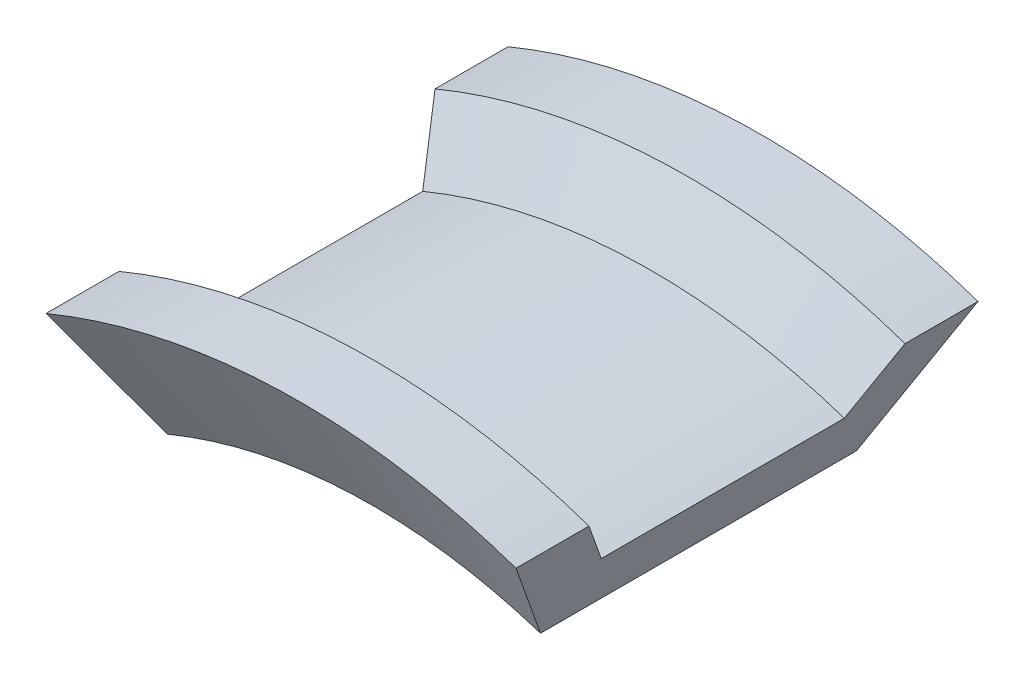
ISO-10303-21;
HEADER;
FILE_DESCRIPTION(('STEP AP214'),'2;1');
FILE_NAME('part.step','',(''),(''),'','','');
FILE_SCHEMA(('AUTOMOTIVE_DESIGN { 1 0 10303 214 1 1 1 1 }'));
ENDSEC;
DATA;
#1=APPLICATION_CONTEXT('core data for automotive mechanical design processes');
#2=APPLICATION_PROTOCOL_DEFINITION('international standard','automotive_design',2000,#1);
#3=PRODUCT_CONTEXT('',#1,'mechanical');
#4=PRODUCT('Part','Part','',(#3));
#5=PRODUCT_RELATED_PRODUCT_CATEGORY('part','',(#4));
#6=PRODUCT_DEFINITION_FORMATION('','',#4);
#7=PRODUCT_DEFINITION_CONTEXT('part definition',#1,'design');
#8=PRODUCT_DEFINITION('design','',#6,#7);
#9=PRODUCT_DEFINITION_SHAPE('','',#8);
#10=(LENGTH_UNIT() NAMED_UNIT(*) SI_UNIT(.MILLI.,.METRE.));
#11=(NAMED_UNIT(*) PLANE_ANGLE_UNIT() SI_UNIT($,.RADIAN.));
#12=(NAMED_UNIT(*) SI_UNIT($,.STERADIAN.) SOLID_ANGLE_UNIT());
#13=UNCERTAINTY_MEASURE_WITH_UNIT(LENGTH_MEASURE(1.E-05),#10,'distance_accuracy_value','');
#14=(GEOMETRIC_REPRESENTATION_CONTEXT(3) GLOBAL_UNCERTAINTY_ASSIGNED_CONTEXT((#13)) GLOBAL_UNIT_ASSIGNED_CONTEXT((#10,
#11,#12)) REPRESENTATION_CONTEXT('',''));
#15=CARTESIAN_POINT('',(0.,0.,0.));
#16=DIRECTION('',(0.,0.,1.));
#17=DIRECTION('',(1.,0.,0.));
#18=AXIS2_PLACEMENT_3D('',#15,#16,#17);
#19=CARTESIAN_POINT('',(-3.2,-27.,0.));
#20=DIRECTION('',(1.,0.,0.));
#21=DIRECTION('',(0.,0.,-1.));
#22=AXIS2_PLACEMENT_3D('',#19,#20,#21);
#23=PLANE('',#22);
#24=CARTESIAN_POINT('',(-3.2,-27.,0.));
#25=DIRECTION('',(1.,0.,0.));
#26=DIRECTION('',(0.,0.,-1.));
#27=AXIS2_PLACEMENT_3D('',#24,#25,#26);
#28=CIRCLE('',#27,6.5);
#29=CARTESIAN_POINT('',(-3.2,-28.6823237931664,6.27851787087894));
#30=VERTEX_POINT('',#29);
#31=CARTESIAN_POINT('',(-3.2,-28.6823237931664,-6.27851787087894));
#32=VERTEX_POINT('',#31);
#33=EDGE_CURVE('E104',#30,#32,#28,.T.);
#34=ORIENTED_EDGE('',*,*,#33,.T.);
#35=DIRECTION('',(0.,0.965925826289068,-0.258819045102521));
#36=VECTOR('',#35,1.);
#37=CARTESIAN_POINT('',(-3.2,-28.6823237931664,-6.27851787087894));
#38=LINE('',#37,#36);
#39=CARTESIAN_POINT('',(-3.2,-16.3880902633976,-9.57274781674013));
#40=VERTEX_POINT('',#39);
#41=EDGE_CURVE('E99',#32,#40,#38,.T.);
#42=ORIENTED_EDGE('',*,*,#41,.T.);
#43=DIRECTION('',(0.,0.,1.));
#44=VECTOR('',#43,1.);
#45=CARTESIAN_POINT('',(-3.2,-16.3880902633976,-9.57274781674013));
#46=LINE('',#45,#44);
#47=CARTESIAN_POINT('',(-3.2,-16.3880902633976,9.57274781674012));
#48=VERTEX_POINT('',#47);
#49=EDGE_CURVE('E102',#40,#48,#46,.T.);
#50=ORIENTED_EDGE('',*,*,#49,.T.);
#51=DIRECTION('',(0.,-0.965925826289068,-0.258819045102522));
#52=VECTOR('',#51,1.);
#53=CARTESIAN_POINT('',(-3.2,-28.6823237931664,6.27851787087894));
#54=LINE('',#53,#52);
#55=EDGE_CURVE('E69',#48,#30,#54,.T.);
#56=ORIENTED_EDGE('',*,*,#55,.T.);
#57=EDGE_LOOP('',(#34,#42,#50,#56));
#58=FACE_BOUND('',#57,.T.);
#59=CARTESIAN_POINT('',(-3.2,-27.,0.));
#60=DIRECTION('',(1.,0.,0.));
#61=DIRECTION('',(0.,0.,-1.));
#62=AXIS2_PLACEMENT_3D('',#59,#60,#61);
#63=CIRCLE('',#62,3.00000000000001);
#64=CARTESIAN_POINT('',(-3.2,-27.,-3.00000000000001));
#65=VERTEX_POINT('',#64);
#66=EDGE_CURVE('E119',#65,#65,#63,.T.);
#67=ORIENTED_EDGE('',*,*,#66,.F.);
#68=EDGE_LOOP('',(#67));
#69=FACE_BOUND('',#68,.T.);
#70=ADVANCED_FACE('F52',(#58,#69),#23,.T.);
#71=CARTESIAN_POINT('',(-6.4,-27.,0.));
#72=DIRECTION('',(1.,0.,0.));
#73=DIRECTION('',(0.,0.,-1.));
#74=AXIS2_PLACEMENT_3D('',#71,#72,#73);
#75=PLANE('',#74);
#76=CARTESIAN_POINT('',(-6.4,-27.,0.));
#77=DIRECTION('',(1.,0.,0.));
#78=DIRECTION('',(0.,0.,-1.));
#79=AXIS2_PLACEMENT_3D('',#76,#77,#78);
#80=CIRCLE('',#79,6.5);
#81=CARTESIAN_POINT('',(-6.4,-28.6823237931664,6.27851787087894));
#82=VERTEX_POINT('',#81);
#83=CARTESIAN_POINT('',(-6.4,-28.6823237931664,-6.27851787087894));
#84=VERTEX_POINT('',#83);
#85=EDGE_CURVE('E116',#82,#84,#80,.T.);
#86=ORIENTED_EDGE('',*,*,#85,.F.);
#87=DIRECTION('',(0.,-0.965925826289068,-0.258819045102522));
#88=VECTOR('',#87,1.);
#89=CARTESIAN_POINT('',(-6.4,-28.6823237931664,6.27851787087894));
#90=LINE('',#89,#88);
#91=CARTESIAN_POINT('',(-6.4,-16.3880902633976,9.57274781674012));
#92=VERTEX_POINT('',#91);
#93=EDGE_CURVE('E92',#92,#82,#90,.T.);
#94=ORIENTED_EDGE('',*,*,#93,.F.);
#95=DIRECTION('',(0.,0.,1.));
#96=VECTOR('',#95,1.);
#97=CARTESIAN_POINT('',(-6.4,-16.3880902633976,-9.57274781674013));
#98=LINE('',#97,#96);
#99=CARTESIAN_POINT('',(-6.4,-16.3880902633976,-9.57274781674013));
#100=VERTEX_POINT('',#99);
#101=EDGE_CURVE('E86',#100,#92,#98,.T.);
#102=ORIENTED_EDGE('',*,*,#101,.F.);
#103=DIRECTION('',(0.,0.965925826289068,-0.258819045102521));
#104=VECTOR('',#103,1.);
#105=CARTESIAN_POINT('',(-6.4,-28.6823237931664,-6.27851787087894));
#106=LINE('',#105,#104);
#107=EDGE_CURVE('E108',#84,#100,#106,.T.);
#108=ORIENTED_EDGE('',*,*,#107,.F.);
#109=EDGE_LOOP('',(#86,#94,#102,#108));
#110=FACE_BOUND('',#109,.T.);
#111=CARTESIAN_POINT('',(-6.4,-27.,0.));
#112=DIRECTION('',(1.,0.,0.));
#113=DIRECTION('',(0.,0.,-1.));
#114=AXIS2_PLACEMENT_3D('',#111,#112,#113);
#115=CIRCLE('',#114,3.00000000000001);
#116=CARTESIAN_POINT('',(-6.4,-27.,-3.00000000000001));
#117=VERTEX_POINT('',#116);
#118=EDGE_CURVE('E131',#117,#117,#115,.T.);
#119=ORIENTED_EDGE('',*,*,#118,.T.);
#120=EDGE_LOOP('',(#119));
#121=FACE_BOUND('',#120,.T.);
#122=ADVANCED_FACE('F127',(#110,#121),#75,.F.);
#123=CARTESIAN_POINT('',(-3.2,-27.,0.));
#124=DIRECTION('',(-1.,0.,0.));
#125=DIRECTION('',(0.,0.,1.));
#126=AXIS2_PLACEMENT_3D('',#123,#124,#125);
#127=CYLINDRICAL_SURFACE('',#126,6.5);
#128=ORIENTED_EDGE('',*,*,#85,.T.);
#129=DIRECTION('',(-1.,0.,0.));
#130=VECTOR('',#129,1.);
#131=CARTESIAN_POINT('',(-3.2,-28.6823237931664,-6.27851787087894));
#132=LINE('',#131,#130);
#133=EDGE_CURVE('E12',#32,#84,#132,.T.);
#134=ORIENTED_EDGE('',*,*,#133,.F.);
#135=ORIENTED_EDGE('',*,*,#33,.F.);
#136=DIRECTION('',(-1.,0.,0.));
#137=VECTOR('',#136,1.);
#138=CARTESIAN_POINT('',(-3.2,-28.6823237931664,6.27851787087894));
#139=LINE('',#138,#137);
#140=EDGE_CURVE('E112',#30,#82,#139,.T.);
#141=ORIENTED_EDGE('',*,*,#140,.T.);
#142=EDGE_LOOP('',(#128,#134,#135,#141));
#143=FACE_BOUND('',#142,.T.);
#144=ADVANCED_FACE('F54',(#143),#127,.T.);
#145=CARTESIAN_POINT('',(-3.2,-28.6823237931664,-6.27851787087894));
#146=DIRECTION('',(0.,0.258819045102521,0.965925826289068));
#147=DIRECTION('',(0.,-0.965925826289068,0.258819045102521));
#148=AXIS2_PLACEMENT_3D('',#145,#146,#147);
#149=PLANE('',#148);
#150=ORIENTED_EDGE('',*,*,#107,.T.);
#151=DIRECTION('',(-1.,0.,0.));
#152=VECTOR('',#151,1.);
#153=CARTESIAN_POINT('',(-3.2,-16.3880902633976,-9.57274781674013));
#154=LINE('',#153,#152);
#155=EDGE_CURVE('E61',#40,#100,#154,.T.);
#156=ORIENTED_EDGE('',*,*,#155,.F.);
#157=ORIENTED_EDGE('',*,*,#41,.F.);
#158=ORIENTED_EDGE('',*,*,#133,.T.);
#159=EDGE_LOOP('',(#150,#156,#157,#158));
#160=FACE_BOUND('',#159,.T.);
#161=ADVANCED_FACE('F107',(#160),#149,.F.);
#162=CARTESIAN_POINT('',(-3.2,-16.3880902633976,-9.57274781674013));
#163=DIRECTION('',(0.,-1.,0.));
#164=DIRECTION('',(0.,0.,-1.));
#165=AXIS2_PLACEMENT_3D('',#162,#163,#164);
#166=PLANE('',#165);
#167=ORIENTED_EDGE('',*,*,#101,.T.);
#168=DIRECTION('',(-1.,0.,0.));
#169=VECTOR('',#168,1.);
#170=CARTESIAN_POINT('',(-3.2,-16.3880902633976,9.57274781674012));
#171=LINE('',#170,#169);
#172=EDGE_CURVE('E109',#48,#92,#171,.T.);
#173=ORIENTED_EDGE('',*,*,#172,.F.);
#174=ORIENTED_EDGE('',*,*,#49,.F.);
#175=ORIENTED_EDGE('',*,*,#155,.T.);
#176=EDGE_LOOP('',(#167,#173,#174,#175));
#177=FACE_BOUND('',#176,.T.);
#178=ADVANCED_FACE('F110',(#177),#166,.F.);
#179=CARTESIAN_POINT('',(-3.2,-28.6823237931664,6.27851787087894));
#180=DIRECTION('',(0.,0.258819045102522,-0.965925826289068));
#181=DIRECTION('',(0.,0.965925826289068,0.258819045102522));
#182=AXIS2_PLACEMENT_3D('',#179,#180,#181);
#183=PLANE('',#182);
#184=ORIENTED_EDGE('',*,*,#93,.T.);
#185=ORIENTED_EDGE('',*,*,#140,.F.);
#186=ORIENTED_EDGE('',*,*,#55,.F.);
#187=ORIENTED_EDGE('',*,*,#172,.T.);
#188=EDGE_LOOP('',(#184,#185,#186,#187));
#189=FACE_BOUND('',#188,.T.);
#190=ADVANCED_FACE('F124',(#189),#183,.F.);
#191=CARTESIAN_POINT('',(-3.2,-27.,0.));
#192=DIRECTION('',(-1.,0.,0.));
#193=DIRECTION('',(0.,0.,1.));
#194=AXIS2_PLACEMENT_3D('',#191,#192,#193);
#195=CYLINDRICAL_SURFACE('',#194,3.00000000000001);
#196=ORIENTED_EDGE('',*,*,#66,.T.);
#197=EDGE_LOOP('',(#196));
#198=FACE_BOUND('',#197,.T.);
#199=ORIENTED_EDGE('',*,*,#118,.F.);
#200=EDGE_LOOP('',(#199));
#201=FACE_BOUND('',#200,.T.);
#202=ADVANCED_FACE('F137',(#198,#201),#195,.F.);
#203=CLOSED_SHELL('',(#70,#122,#144,#161,#178,#190,#202));
#204=MANIFOLD_SOLID_BREP('B2',#203);
#205=CARTESIAN_POINT('',(9.6,-27.,0.));
#206=DIRECTION('',(-1.,0.,0.));
#207=DIRECTION('',(0.,0.,1.));
#208=AXIS2_PLACEMENT_3D('',#205,#206,#207);
#209=CYLINDRICAL_SURFACE('',#208,3.00000000000001);
#210=CARTESIAN_POINT('',(6.4,-27.,0.));
#211=DIRECTION('',(1.,0.,0.));
#212=DIRECTION('',(0.,0.,-1.));
#213=AXIS2_PLACEMENT_3D('',#210,#211,#212);
#214=CIRCLE('',#213,3.00000000000001);
#215=CARTESIAN_POINT('',(6.4,-27.,-3.00000000000001));
#216=VERTEX_POINT('',#215);
#217=EDGE_CURVE('E262',#216,#216,#214,.T.);
#218=ORIENTED_EDGE('',*,*,#217,.F.);
#219=EDGE_LOOP('',(#218));
#220=FACE_BOUND('',#219,.T.);
#221=CARTESIAN_POINT('',(7.85,-27.,0.));
#222=DIRECTION('',(1.,0.,0.));
#223=DIRECTION('',(0.,0.,-1.));
#224=AXIS2_PLACEMENT_3D('',#221,#222,#223);
#225=CIRCLE('',#224,3.00000000000001);
#226=CARTESIAN_POINT('',(7.85,-27.,-3.00000000000001));
#227=VERTEX_POINT('',#226);
#228=EDGE_CURVE('E197',#227,#227,#225,.T.);
#229=ORIENTED_EDGE('',*,*,#228,.T.);
#230=EDGE_LOOP('',(#229));
#231=FACE_BOUND('',#230,.T.);
#232=ADVANCED_FACE('F193',(#220,#231),#209,.F.);
#233=CARTESIAN_POINT('',(9.6,-27.,0.));
#234=DIRECTION('',(1.,0.,0.));
#235=DIRECTION('',(0.,0.,-1.));
#236=AXIS2_PLACEMENT_3D('',#233,#234,#235);
#237=PLANE('',#236);
#238=CARTESIAN_POINT('',(9.6,-27.,0.));
#239=DIRECTION('',(1.,0.,0.));
#240=DIRECTION('',(0.,0.,-1.));
#241=AXIS2_PLACEMENT_3D('',#238,#239,#240);
#242=CIRCLE('',#241,5.25);
#243=CARTESIAN_POINT('',(9.6,-27.,-5.25000000000001));
#244=VERTEX_POINT('',#243);
#245=EDGE_CURVE('E276',#244,#244,#242,.T.);
#246=ORIENTED_EDGE('',*,*,#245,.F.);
#247=EDGE_LOOP('',(#246));
#248=FACE_BOUND('',#247,.T.);
#249=CARTESIAN_POINT('',(9.6,-27.,0.));
#250=DIRECTION('',(1.,0.,0.));
#251=DIRECTION('',(0.,0.,-1.));
#252=AXIS2_PLACEMENT_3D('',#249,#250,#251);
#253=CIRCLE('',#252,6.5);
#254=CARTESIAN_POINT('',(9.6,-28.6823237931664,6.27851787087894));
#255=VERTEX_POINT('',#254);
#256=CARTESIAN_POINT('',(9.6,-28.6823237931664,-6.27851787087894));
#257=VERTEX_POINT('',#256);
#258=EDGE_CURVE('E246',#255,#257,#253,.T.);
#259=ORIENTED_EDGE('',*,*,#258,.T.);
#260=DIRECTION('',(0.,0.965925826289068,-0.258819045102521));
#261=VECTOR('',#260,1.);
#262=CARTESIAN_POINT('',(9.6,-28.6823237931664,-6.27851787087894));
#263=LINE('',#262,#261);
#264=CARTESIAN_POINT('',(9.6,-16.3880902633976,-9.57274781674013));
#265=VERTEX_POINT('',#264);
#266=EDGE_CURVE('E241',#257,#265,#263,.T.);
#267=ORIENTED_EDGE('',*,*,#266,.T.);
#268=DIRECTION('',(0.,0.,1.));
#269=VECTOR('',#268,1.);
#270=CARTESIAN_POINT('',(9.6,-16.3880902633976,-9.57274781674013));
#271=LINE('',#270,#269);
#272=CARTESIAN_POINT('',(9.6,-16.3880902633976,9.57274781674012));
#273=VERTEX_POINT('',#272);
#274=EDGE_CURVE('E244',#265,#273,#271,.T.);
#275=ORIENTED_EDGE('',*,*,#274,.T.);
#276=DIRECTION('',(0.,-0.965925826289068,-0.258819045102522));
#277=VECTOR('',#276,1.);
#278=CARTESIAN_POINT('',(9.6,-28.6823237931664,6.27851787087894));
#279=LINE('',#278,#277);
#280=EDGE_CURVE('E211',#273,#255,#279,.T.);
#281=ORIENTED_EDGE('',*,*,#280,.T.);
#282=EDGE_LOOP('',(#259,#267,#275,#281));
#283=FACE_BOUND('',#282,.T.);
#284=ADVANCED_FACE('F242',(#248,#283),#237,.T.);
#285=CARTESIAN_POINT('',(6.4,-27.,0.));
#286=DIRECTION('',(1.,0.,0.));
#287=DIRECTION('',(0.,0.,-1.));
#288=AXIS2_PLACEMENT_3D('',#285,#286,#287);
#289=PLANE('',#288);
#290=CARTESIAN_POINT('',(6.4,-27.,0.));
#291=DIRECTION('',(1.,0.,0.));
#292=DIRECTION('',(0.,0.,-1.));
#293=AXIS2_PLACEMENT_3D('',#290,#291,#292);
#294=CIRCLE('',#293,6.5);
#295=CARTESIAN_POINT('',(6.4,-28.6823237931664,6.27851787087894));
#296=VERTEX_POINT('',#295);
#297=CARTESIAN_POINT('',(6.4,-28.6823237931664,-6.27851787087894));
#298=VERTEX_POINT('',#297);
#299=EDGE_CURVE('E259',#296,#298,#294,.T.);
#300=ORIENTED_EDGE('',*,*,#299,.F.);
#301=DIRECTION('',(0.,-0.965925826289068,-0.258819045102522));
#302=VECTOR('',#301,1.);
#303=CARTESIAN_POINT('',(6.4,-28.6823237931664,6.27851787087894));
#304=LINE('',#303,#302);
#305=CARTESIAN_POINT('',(6.4,-16.3880902633976,9.57274781674012));
#306=VERTEX_POINT('',#305);
#307=EDGE_CURVE('E234',#306,#296,#304,.T.);
#308=ORIENTED_EDGE('',*,*,#307,.F.);
#309=DIRECTION('',(0.,0.,1.));
#310=VECTOR('',#309,1.);
#311=CARTESIAN_POINT('',(6.4,-16.3880902633976,-9.57274781674013));
#312=LINE('',#311,#310);
#313=CARTESIAN_POINT('',(6.4,-16.3880902633976,-9.57274781674013));
#314=VERTEX_POINT('',#313);
#315=EDGE_CURVE('E228',#314,#306,#312,.T.);
#316=ORIENTED_EDGE('',*,*,#315,.F.);
#317=DIRECTION('',(0.,0.965925826289068,-0.258819045102521));
#318=VECTOR('',#317,1.);
#319=CARTESIAN_POINT('',(6.4,-28.6823237931664,-6.27851787087894));
#320=LINE('',#319,#318);
#321=EDGE_CURVE('E250',#298,#314,#320,.T.);
#322=ORIENTED_EDGE('',*,*,#321,.F.);
#323=EDGE_LOOP('',(#300,#308,#316,#322));
#324=FACE_BOUND('',#323,.T.);
#325=ORIENTED_EDGE('',*,*,#217,.T.);
#326=EDGE_LOOP('',(#325));
#327=FACE_BOUND('',#326,.T.);
#328=ADVANCED_FACE('F270',(#324,#327),#289,.F.);
#329=CARTESIAN_POINT('',(9.6,-27.,0.));
#330=DIRECTION('',(-1.,0.,0.));
#331=DIRECTION('',(0.,0.,1.));
#332=AXIS2_PLACEMENT_3D('',#329,#330,#331);
#333=CYLINDRICAL_SURFACE('',#332,6.5);
#334=ORIENTED_EDGE('',*,*,#299,.T.);
#335=DIRECTION('',(-1.,0.,0.));
#336=VECTOR('',#335,1.);
#337=CARTESIAN_POINT('',(9.6,-28.6823237931664,-6.27851787087894));
#338=LINE('',#337,#336);
#339=EDGE_CURVE('E50',#257,#298,#338,.T.);
#340=ORIENTED_EDGE('',*,*,#339,.F.);
#341=ORIENTED_EDGE('',*,*,#258,.F.);
#342=DIRECTION('',(-1.,0.,0.));
#343=VECTOR('',#342,1.);
#344=CARTESIAN_POINT('',(9.6,-28.6823237931664,6.27851787087894));
#345=LINE('',#344,#343);
#346=EDGE_CURVE('E255',#255,#296,#345,.T.);
#347=ORIENTED_EDGE('',*,*,#346,.T.);
#348=EDGE_LOOP('',(#334,#340,#341,#347));
#349=FACE_BOUND('',#348,.T.);
#350=ADVANCED_FACE('F195',(#349),#333,.T.);
#351=CARTESIAN_POINT('',(9.6,-28.6823237931664,-6.27851787087894));
#352=DIRECTION('',(0.,0.258819045102521,0.965925826289068));
#353=DIRECTION('',(0.,-0.965925826289068,0.258819045102521));
#354=AXIS2_PLACEMENT_3D('',#351,#352,#353);
#355=PLANE('',#354);
#356=ORIENTED_EDGE('',*,*,#321,.T.);
#357=DIRECTION('',(-1.,0.,0.));
#358=VECTOR('',#357,1.);
#359=CARTESIAN_POINT('',(9.6,-16.3880902633976,-9.57274781674013));
#360=LINE('',#359,#358);
#361=EDGE_CURVE('E203',#265,#314,#360,.T.);
#362=ORIENTED_EDGE('',*,*,#361,.F.);
#363=ORIENTED_EDGE('',*,*,#266,.F.);
#364=ORIENTED_EDGE('',*,*,#339,.T.);
#365=EDGE_LOOP('',(#356,#362,#363,#364));
#366=FACE_BOUND('',#365,.T.);
#367=ADVANCED_FACE('F249',(#366),#355,.F.);
#368=CARTESIAN_POINT('',(9.6,-16.3880902633976,-9.57274781674013));
#369=DIRECTION('',(0.,-1.,0.));
#370=DIRECTION('',(0.,0.,-1.));
#371=AXIS2_PLACEMENT_3D('',#368,#369,#370);
#372=PLANE('',#371);
#373=ORIENTED_EDGE('',*,*,#315,.T.);
#374=DIRECTION('',(-1.,0.,0.));
#375=VECTOR('',#374,1.);
#376=CARTESIAN_POINT('',(9.6,-16.3880902633976,9.57274781674012));
#377=LINE('',#376,#375);
#378=EDGE_CURVE('E251',#273,#306,#377,.T.);
#379=ORIENTED_EDGE('',*,*,#378,.F.);
#380=ORIENTED_EDGE('',*,*,#274,.F.);
#381=ORIENTED_EDGE('',*,*,#361,.T.);
#382=EDGE_LOOP('',(#373,#379,#380,#381));
#383=FACE_BOUND('',#382,.T.);
#384=ADVANCED_FACE('F253',(#383),#372,.F.);
#385=CARTESIAN_POINT('',(9.6,-28.6823237931664,6.27851787087894));
#386=DIRECTION('',(0.,0.258819045102522,-0.965925826289068));
#387=DIRECTION('',(0.,0.965925826289068,0.258819045102522));
#388=AXIS2_PLACEMENT_3D('',#385,#386,#387);
#389=PLANE('',#388);
#390=ORIENTED_EDGE('',*,*,#307,.T.);
#391=ORIENTED_EDGE('',*,*,#346,.F.);
#392=ORIENTED_EDGE('',*,*,#280,.F.);
#393=ORIENTED_EDGE('',*,*,#378,.T.);
#394=EDGE_LOOP('',(#390,#391,#392,#393));
#395=FACE_BOUND('',#394,.T.);
#396=ADVANCED_FACE('F267',(#395),#389,.F.);
#397=CARTESIAN_POINT('',(7.85,-27.,0.));
#398=DIRECTION('',(1.,0.,0.));
#399=DIRECTION('',(0.,0.,-1.));
#400=AXIS2_PLACEMENT_3D('',#397,#398,#399);
#401=CYLINDRICAL_SURFACE('',#400,5.25);
#402=CARTESIAN_POINT('',(7.85,-27.,0.));
#403=DIRECTION('',(1.,0.,0.));
#404=DIRECTION('',(0.,0.,-1.));
#405=AXIS2_PLACEMENT_3D('',#402,#403,#404);
#406=CIRCLE('',#405,5.25);
#407=CARTESIAN_POINT('',(7.85,-27.,-5.25000000000001));
#408=VERTEX_POINT('',#407);
#409=EDGE_CURVE('E279',#408,#408,#406,.T.);
#410=ORIENTED_EDGE('',*,*,#409,.F.);
#411=EDGE_LOOP('',(#410));
#412=FACE_BOUND('',#411,.T.);
#413=ORIENTED_EDGE('',*,*,#245,.T.);
#414=EDGE_LOOP('',(#413));
#415=FACE_BOUND('',#414,.T.);
#416=ADVANCED_FACE('F289',(#412,#415),#401,.F.);
#417=CARTESIAN_POINT('',(7.85,-27.,0.));
#418=DIRECTION('',(1.,0.,0.));
#419=DIRECTION('',(0.,0.,-1.));
#420=AXIS2_PLACEMENT_3D('',#417,#418,#419);
#421=PLANE('',#420);
#422=ORIENTED_EDGE('',*,*,#228,.F.);
#423=EDGE_LOOP('',(#422));
#424=FACE_BOUND('',#423,.T.);
#425=ORIENTED_EDGE('',*,*,#409,.T.);
#426=EDGE_LOOP('',(#425));
#427=FACE_BOUND('',#426,.T.);
#428=ADVANCED_FACE('F287',(#424,#427),#421,.T.);
#429=CLOSED_SHELL('',(#232,#284,#328,#350,#367,#384,#396,#416,#428));
#430=MANIFOLD_SOLID_BREP('B6',#429);
#431=CARTESIAN_POINT('',(3.2,-27.,0.));
#432=DIRECTION('',(1.,0.,0.));
#433=DIRECTION('',(0.,0.,-1.));
#434=AXIS2_PLACEMENT_3D('',#431,#432,#433);
#435=PLANE('',#434);
#436=CARTESIAN_POINT('',(3.2,-27.,0.));
#437=DIRECTION('',(1.,0.,0.));
#438=DIRECTION('',(0.,0.,-1.));
#439=AXIS2_PLACEMENT_3D('',#436,#437,#438);
#440=CIRCLE('',#439,6.5);
#441=CARTESIAN_POINT('',(3.2,-28.6823237931664,6.27851787087894));
#442=VERTEX_POINT('',#441);
#443=CARTESIAN_POINT('',(3.2,-28.6823237931664,-6.27851787087894));
#444=VERTEX_POINT('',#443);
#445=EDGE_CURVE('E411',#442,#444,#440,.T.);
#446=ORIENTED_EDGE('',*,*,#445,.T.);
#447=DIRECTION('',(0.,0.965925826289068,-0.258819045102521));
#448=VECTOR('',#447,1.);
#449=CARTESIAN_POINT('',(3.2,-28.6823237931664,-6.27851787087894));
#450=LINE('',#449,#448);
#451=CARTESIAN_POINT('',(3.2,-16.3880902633976,-9.57274781674013));
#452=VERTEX_POINT('',#451);
#453=EDGE_CURVE('E406',#444,#452,#450,.T.);
#454=ORIENTED_EDGE('',*,*,#453,.T.);
#455=DIRECTION('',(0.,0.,1.));
#456=VECTOR('',#455,1.);
#457=CARTESIAN_POINT('',(3.2,-16.3880902633976,-9.57274781674013));
#458=LINE('',#457,#456);
#459=CARTESIAN_POINT('',(3.2,-16.3880902633976,9.57274781674012));
#460=VERTEX_POINT('',#459);
#461=EDGE_CURVE('E409',#452,#460,#458,.T.);
#462=ORIENTED_EDGE('',*,*,#461,.T.);
#463=DIRECTION('',(0.,-0.965925826289068,-0.258819045102522));
#464=VECTOR('',#463,1.);
#465=CARTESIAN_POINT('',(3.2,-28.6823237931664,6.27851787087894));
#466=LINE('',#465,#464);
#467=EDGE_CURVE('E376',#460,#442,#466,.T.);
#468=ORIENTED_EDGE('',*,*,#467,.T.);
#469=EDGE_LOOP('',(#446,#454,#462,#468));
#470=FACE_BOUND('',#469,.T.);
#471=CARTESIAN_POINT('',(3.2,-27.,0.));
#472=DIRECTION('',(1.,0.,0.));
#473=DIRECTION('',(0.,0.,-1.));
#474=AXIS2_PLACEMENT_3D('',#471,#472,#473);
#475=CIRCLE('',#474,3.00000000000001);
#476=CARTESIAN_POINT('',(3.2,-27.,-3.00000000000001));
#477=VERTEX_POINT('',#476);
#478=EDGE_CURVE('E426',#477,#477,#475,.T.);
#479=ORIENTED_EDGE('',*,*,#478,.F.);
#480=EDGE_LOOP('',(#479));
#481=FACE_BOUND('',#480,.T.);
#482=ADVANCED_FACE('F359',(#470,#481),#435,.T.);
#483=CARTESIAN_POINT('',(0.,-27.,0.));
#484=DIRECTION('',(1.,0.,0.));
#485=DIRECTION('',(0.,0.,-1.));
#486=AXIS2_PLACEMENT_3D('',#483,#484,#485);
#487=PLANE('',#486);
#488=CARTESIAN_POINT('',(0.,-27.,0.));
#489=DIRECTION('',(1.,0.,0.));
#490=DIRECTION('',(0.,0.,-1.));
#491=AXIS2_PLACEMENT_3D('',#488,#489,#490);
#492=CIRCLE('',#491,6.5);
#493=CARTESIAN_POINT('',(0.,-28.6823237931664,6.27851787087894));
#494=VERTEX_POINT('',#493);
#495=CARTESIAN_POINT('',(0.,-28.6823237931664,-6.27851787087894));
#496=VERTEX_POINT('',#495);
#497=EDGE_CURVE('E423',#494,#496,#492,.T.);
#498=ORIENTED_EDGE('',*,*,#497,.F.);
#499=DIRECTION('',(0.,-0.965925826289068,-0.258819045102522));
#500=VECTOR('',#499,1.);
#501=CARTESIAN_POINT('',(0.,-28.6823237931664,6.27851787087894));
#502=LINE('',#501,#500);
#503=CARTESIAN_POINT('',(0.,-16.3880902633976,9.57274781674012));
#504=VERTEX_POINT('',#503);
#505=EDGE_CURVE('E399',#504,#494,#502,.T.);
#506=ORIENTED_EDGE('',*,*,#505,.F.);
#507=DIRECTION('',(0.,0.,1.));
#508=VECTOR('',#507,1.);
#509=CARTESIAN_POINT('',(0.,-16.3880902633976,-9.57274781674013));
#510=LINE('',#509,#508);
#511=CARTESIAN_POINT('',(0.,-16.3880902633976,-9.57274781674013));
#512=VERTEX_POINT('',#511);
#513=EDGE_CURVE('E393',#512,#504,#510,.T.);
#514=ORIENTED_EDGE('',*,*,#513,.F.);
#515=DIRECTION('',(0.,0.965925826289068,-0.258819045102521));
#516=VECTOR('',#515,1.);
#517=CARTESIAN_POINT('',(0.,-28.6823237931664,-6.27851787087894));
#518=LINE('',#517,#516);
#519=EDGE_CURVE('E415',#496,#512,#518,.T.);
#520=ORIENTED_EDGE('',*,*,#519,.F.);
#521=EDGE_LOOP('',(#498,#506,#514,#520));
#522=FACE_BOUND('',#521,.T.);
#523=CARTESIAN_POINT('',(0.,-27.,0.));
#524=DIRECTION('',(1.,0.,0.));
#525=DIRECTION('',(0.,0.,-1.));
#526=AXIS2_PLACEMENT_3D('',#523,#524,#525);
#527=CIRCLE('',#526,3.00000000000001);
#528=CARTESIAN_POINT('',(0.,-27.,-3.00000000000001));
#529=VERTEX_POINT('',#528);
#530=EDGE_CURVE('E438',#529,#529,#527,.T.);
#531=ORIENTED_EDGE('',*,*,#530,.T.);
#532=EDGE_LOOP('',(#531));
#533=FACE_BOUND('',#532,.T.);
#534=ADVANCED_FACE('F434',(#522,#533),#487,.F.);
#535=CARTESIAN_POINT('',(3.2,-27.,0.));
#536=DIRECTION('',(-1.,0.,0.));
#537=DIRECTION('',(0.,0.,1.));
#538=AXIS2_PLACEMENT_3D('',#535,#536,#537);
#539=CYLINDRICAL_SURFACE('',#538,6.5);
#540=ORIENTED_EDGE('',*,*,#497,.T.);
#541=DIRECTION('',(-1.,0.,0.));
#542=VECTOR('',#541,1.);
#543=CARTESIAN_POINT('',(3.2,-28.6823237931664,-6.27851787087894));
#544=LINE('',#543,#542);
#545=EDGE_CURVE('E191',#444,#496,#544,.T.);
#546=ORIENTED_EDGE('',*,*,#545,.F.);
#547=ORIENTED_EDGE('',*,*,#445,.F.);
#548=DIRECTION('',(-1.,0.,0.));
#549=VECTOR('',#548,1.);
#550=CARTESIAN_POINT('',(3.2,-28.6823237931664,6.27851787087894));
#551=LINE('',#550,#549);
#552=EDGE_CURVE('E419',#442,#494,#551,.T.);
#553=ORIENTED_EDGE('',*,*,#552,.T.);
#554=EDGE_LOOP('',(#540,#546,#547,#553));
#555=FACE_BOUND('',#554,.T.);
#556=ADVANCED_FACE('F361',(#555),#539,.T.);
#557=CARTESIAN_POINT('',(3.2,-28.6823237931664,-6.27851787087894));
#558=DIRECTION('',(0.,0.258819045102521,0.965925826289068));
#559=DIRECTION('',(0.,-0.965925826289068,0.258819045102521));
#560=AXIS2_PLACEMENT_3D('',#557,#558,#559);
#561=PLANE('',#560);
#562=ORIENTED_EDGE('',*,*,#519,.T.);
#563=DIRECTION('',(-1.,0.,0.));
#564=VECTOR('',#563,1.);
#565=CARTESIAN_POINT('',(3.2,-16.3880902633976,-9.57274781674013));
#566=LINE('',#565,#564);
#567=EDGE_CURVE('E368',#452,#512,#566,.T.);
#568=ORIENTED_EDGE('',*,*,#567,.F.);
#569=ORIENTED_EDGE('',*,*,#453,.F.);
#570=ORIENTED_EDGE('',*,*,#545,.T.);
#571=EDGE_LOOP('',(#562,#568,#569,#570));
#572=FACE_BOUND('',#571,.T.);
#573=ADVANCED_FACE('F414',(#572),#561,.F.);
#574=CARTESIAN_POINT('',(3.2,-16.3880902633976,-9.57274781674013));
#575=DIRECTION('',(0.,-1.,0.));
#576=DIRECTION('',(0.,0.,-1.));
#577=AXIS2_PLACEMENT_3D('',#574,#575,#576);
#578=PLANE('',#577);
#579=ORIENTED_EDGE('',*,*,#513,.T.);
#580=DIRECTION('',(-1.,0.,0.));
#581=VECTOR('',#580,1.);
#582=CARTESIAN_POINT('',(3.2,-16.3880902633976,9.57274781674012));
#583=LINE('',#582,#581);
#584=EDGE_CURVE('E416',#460,#504,#583,.T.);
#585=ORIENTED_EDGE('',*,*,#584,.F.);
#586=ORIENTED_EDGE('',*,*,#461,.F.);
#587=ORIENTED_EDGE('',*,*,#567,.T.);
#588=EDGE_LOOP('',(#579,#585,#586,#587));
#589=FACE_BOUND('',#588,.T.);
#590=ADVANCED_FACE('F417',(#589),#578,.F.);
#591=CARTESIAN_POINT('',(3.2,-28.6823237931664,6.27851787087894));
#592=DIRECTION('',(0.,0.258819045102522,-0.965925826289068));
#593=DIRECTION('',(0.,0.965925826289068,0.258819045102522));
#594=AXIS2_PLACEMENT_3D('',#591,#592,#593);
#595=PLANE('',#594);
#596=ORIENTED_EDGE('',*,*,#505,.T.);
#597=ORIENTED_EDGE('',*,*,#552,.F.);
#598=ORIENTED_EDGE('',*,*,#467,.F.);
#599=ORIENTED_EDGE('',*,*,#584,.T.);
#600=EDGE_LOOP('',(#596,#597,#598,#599));
#601=FACE_BOUND('',#600,.T.);
#602=ADVANCED_FACE('F431',(#601),#595,.F.);
#603=CARTESIAN_POINT('',(3.2,-27.,0.));
#604=DIRECTION('',(-1.,0.,0.));
#605=DIRECTION('',(0.,0.,1.));
#606=AXIS2_PLACEMENT_3D('',#603,#604,#605);
#607=CYLINDRICAL_SURFACE('',#606,3.00000000000001);
#608=ORIENTED_EDGE('',*,*,#478,.T.);
#609=EDGE_LOOP('',(#608));
#610=FACE_BOUND('',#609,.T.);
#611=ORIENTED_EDGE('',*,*,#530,.F.);
#612=EDGE_LOOP('',(#611));
#613=FACE_BOUND('',#612,.T.);
#614=ADVANCED_FACE('F444',(#610,#613),#607,.F.);
#615=CLOSED_SHELL('',(#482,#534,#556,#573,#590,#602,#614));
#616=MANIFOLD_SOLID_BREP('B44',#615);
#617=CARTESIAN_POINT('',(3.47446074950895,-101.388090263398,19.2264973081037));
#618=DIRECTION('',(0.,0.,1.));
#619=DIRECTION('',(1.,0.,0.));
#620=AXIS2_PLACEMENT_3D('',#617,#618,#619);
#621=CONICAL_SURFACE('',#620,95.,1.0471975511966);
#622=CARTESIAN_POINT('',(3.47446074950895,-101.388090263398,25.));
#623=DIRECTION('',(0.,0.,-1.));
#624=DIRECTION('',(-0.382683432365084,0.923879532511289,0.));
#625=AXIS2_PLACEMENT_3D('',#622,#623,#624);
#626=CIRCLE('',#625,105.);
#627=CARTESIAN_POINT('',(-36.7072996488249,-4.38073934971225,25.));
#628=VERTEX_POINT('',#627);
#629=CARTESIAN_POINT('',(37.6497673706726,-2.10542099353232,25.));
#630=VERTEX_POINT('',#629);
#631=EDGE_CURVE('E565',#628,#630,#626,.T.);
#632=ORIENTED_EDGE('',*,*,#631,.T.);
#633=CARTESIAN_POINT('',(37.6499001845902,-2.105100352371,25.0002));
#634=CARTESIAN_POINT('',(37.0107614384524,-3.64811778153508,24.0377329907076));
#635=CARTESIAN_POINT('',(36.3716061675837,-5.19117510492843,23.0753409284518));
#636=CARTESIAN_POINT('',(35.093262576256,-8.27736954048442,21.1507066978197));
#637=CARTESIAN_POINT('',(34.454074255797,-9.82050665264708,20.1884645294434));
#638=CARTESIAN_POINT('',(33.8148694106071,-11.363683659039,19.2262973081038));
#639=B_SPLINE_CURVE_WITH_KNOTS('',3,(#633,#634,#635,#636,#637,#638),.UNSPECIFIED.,.F.,.F.,(4,2,
4),(0.,5.78287943895168,11.5657588790678),.UNSPECIFIED.);
#640=CARTESIAN_POINT('',(33.8150022797829,-11.3633628844728,19.2264973081037));
#641=VERTEX_POINT('',#640);
#642=EDGE_CURVE('E553',#630,#641,#639,.T.);
#643=ORIENTED_EDGE('',*,*,#642,.T.);
#644=CARTESIAN_POINT('',(3.47446074950895,-101.388090263398,19.2264973081037));
#645=DIRECTION('',(0.,0.,-1.));
#646=DIRECTION('',(-0.382683432365084,0.923879532511289,0.));
#647=AXIS2_PLACEMENT_3D('',#644,#645,#646);
#648=CIRCLE('',#647,95.);
#649=CARTESIAN_POINT('',(-32.8804653251741,-13.6195346748251,19.2264973081037));
#650=VERTEX_POINT('',#649);
#651=EDGE_CURVE('E563',#650,#641,#648,.T.);
#652=ORIENTED_EDGE('',*,*,#651,.F.);
#653=DIRECTION('',(-0.331413574035587,0.800103145191267,0.500000000000001));
#654=VECTOR('',#653,1.);
#655=CARTESIAN_POINT('',(-32.880465325174,-13.6195346748251,19.2264973081037));
#656=LINE('',#655,#654);
#657=EDGE_CURVE('E566',#650,#628,#656,.T.);
#658=ORIENTED_EDGE('',*,*,#657,.T.);
#659=EDGE_LOOP('',(#632,#643,#652,#658));
#660=FACE_BOUND('',#659,.T.);
#661=ADVANCED_FACE('F490',(#660),#621,.T.);
#662=CARTESIAN_POINT('',(3.47446074950895,-101.388090263398,0.));
#663=DIRECTION('',(0.,0.,-1.));
#664=DIRECTION('',(-1.,0.,0.));
#665=AXIS2_PLACEMENT_3D('',#662,#663,#664);
#666=CYLINDRICAL_SURFACE('',#665,105.);
#667=CARTESIAN_POINT('',(3.47446074950895,-101.388090263398,36.5470053837925));
#668=DIRECTION('',(0.,0.,-1.));
#669=DIRECTION('',(-0.382683432365084,0.923879532511289,0.));
#670=AXIS2_PLACEMENT_3D('',#667,#668,#669);
#671=CIRCLE('',#670,105.);
#672=CARTESIAN_POINT('',(-36.7072996488249,-4.38073934971224,36.5470053837925));
#673=VERTEX_POINT('',#672);
#674=CARTESIAN_POINT('',(37.6497673706726,-2.10542099353232,36.5470053837925));
#675=VERTEX_POINT('',#674);
#676=EDGE_CURVE('E571',#673,#675,#671,.T.);
#677=ORIENTED_EDGE('',*,*,#676,.T.);
#678=DIRECTION('',(0.,0.,-1.));
#679=VECTOR('',#678,1.);
#680=CARTESIAN_POINT('',(37.6497673706726,-2.10542099353232,0.));
#681=LINE('',#680,#679);
#682=EDGE_CURVE('E567',#675,#630,#681,.T.);
#683=ORIENTED_EDGE('',*,*,#682,.T.);
#684=ORIENTED_EDGE('',*,*,#631,.F.);
#685=DIRECTION('',(0.,0.,1.));
#686=VECTOR('',#685,1.);
#687=CARTESIAN_POINT('',(-36.7072996488249,-4.38073934971225,25.));
#688=LINE('',#687,#686);
#689=EDGE_CURVE('E576',#628,#673,#688,.T.);
#690=ORIENTED_EDGE('',*,*,#689,.T.);
#691=EDGE_LOOP('',(#677,#683,#684,#690));
#692=FACE_BOUND('',#691,.T.);
#693=ADVANCED_FACE('F630',(#692),#666,.T.);
#694=CARTESIAN_POINT('',(3.47446074950895,-101.388090263398,36.5470053837925));
#695=DIRECTION('',(0.,0.,1.));
#696=DIRECTION('',(1.,0.,0.));
#697=AXIS2_PLACEMENT_3D('',#694,#695,#696);
#698=CONICAL_SURFACE('',#697,105.,1.0471975511966);
#699=CARTESIAN_POINT('',(3.47446074950895,-101.388090263398,25.));
#700=DIRECTION('',(0.,0.,-1.));
#701=DIRECTION('',(-0.382683432365084,0.923879532511289,0.));
#702=AXIS2_PLACEMENT_3D('',#699,#700,#701);
#703=CIRCLE('',#702,85.);
#704=CARTESIAN_POINT('',(-29.0536310015232,-22.858329999938,25.));
#705=VERTEX_POINT('',#704);
#706=CARTESIAN_POINT('',(29.9783638954648,-20.6258273058145,25.));
#707=VERTEX_POINT('',#706);
#708=EDGE_CURVE('E582',#705,#707,#703,.T.);
#709=ORIENTED_EDGE('',*,*,#708,.T.);
#710=CARTESIAN_POINT('',(29.9782309502896,-20.6261482638595,24.9998));
#711=CARTESIAN_POINT('',(30.6176233732874,-19.0825184045797,25.9616906301028));
#712=CARTESIAN_POINT('',(31.2569895425153,-17.5389519275071,26.9237004163929));
#713=CARTESIAN_POINT('',(32.5356764965004,-14.451928541167,28.8479258850572));
#714=CARTESIAN_POINT('',(33.1749972812581,-12.9084716318981,29.810141567429));
#715=CARTESIAN_POINT('',(34.4536006016509,-9.82165015491052,31.7347464304389));
#716=CARTESIAN_POINT('',(35.0928831372862,-8.27828558719159,32.6971356110764));
#717=CARTESIAN_POINT('',(36.371415155654,-5.19163624851981,34.6220639252561));
#718=CARTESIAN_POINT('',(37.0106646383862,-3.64835147756785,35.5846030587999));
#719=CARTESIAN_POINT('',(37.6499001845902,-2.10510035237102,36.5472053837925));
#720=B_SPLINE_CURVE_WITH_KNOTS('',3,(#710,#711,#712,#713,#714,#715,#716,#717,#718,#719),
.UNSPECIFIED.,.F.,.F.,(4,2,2,2,4),(0.,5.78373965820115,11.5674792515302,17.3512188261895,
23.1349584655776),.UNSPECIFIED.);
#721=EDGE_CURVE('E628',#707,#675,#720,.T.);
#722=ORIENTED_EDGE('',*,*,#721,.T.);
#723=ORIENTED_EDGE('',*,*,#676,.F.);
#724=DIRECTION('',(0.331413574035587,-0.800103145191267,-0.500000000000001));
#725=VECTOR('',#724,1.);
#726=CARTESIAN_POINT('',(-36.7072996488249,-4.38073934971224,36.5470053837925));
#727=LINE('',#726,#725);
#728=EDGE_CURVE('E579',#673,#705,#727,.T.);
#729=ORIENTED_EDGE('',*,*,#728,.T.);
#730=EDGE_LOOP('',(#709,#722,#723,#729));
#731=FACE_BOUND('',#730,.T.);
#732=ADVANCED_FACE('F626',(#731),#698,.F.);
#733=CARTESIAN_POINT('',(3.47446074950895,-101.388090263398,0.));
#734=DIRECTION('',(0.,0.,-1.));
#735=DIRECTION('',(-1.,0.,0.));
#736=AXIS2_PLACEMENT_3D('',#733,#734,#735);
#737=CYLINDRICAL_SURFACE('',#736,85.);
#738=CARTESIAN_POINT('',(3.47446074950895,-101.388090263398,-25.));
#739=DIRECTION('',(0.,0.,-1.));
#740=DIRECTION('',(-0.382683432365084,0.923879532511289,0.));
#741=AXIS2_PLACEMENT_3D('',#738,#739,#740);
#742=CIRCLE('',#741,85.);
#743=CARTESIAN_POINT('',(-29.0536310015232,-22.858329999938,-25.));
#744=VERTEX_POINT('',#743);
#745=CARTESIAN_POINT('',(29.9783638954648,-20.6258273058145,-25.));
#746=VERTEX_POINT('',#745);
#747=EDGE_CURVE('E588',#744,#746,#742,.T.);
#748=ORIENTED_EDGE('',*,*,#747,.T.);
#749=DIRECTION('',(0.,0.,-1.));
#750=VECTOR('',#749,1.);
#751=CARTESIAN_POINT('',(29.9783638954648,-20.6258273058145,0.));
#752=LINE('',#751,#750);
#753=EDGE_CURVE('E623',#746,#707,#752,.F.);
#754=ORIENTED_EDGE('',*,*,#753,.T.);
#755=ORIENTED_EDGE('',*,*,#708,.F.);
#756=DIRECTION('',(0.,0.,-1.));
#757=VECTOR('',#756,1.);
#758=CARTESIAN_POINT('',(-29.0536310015232,-22.858329999938,-25.));
#759=LINE('',#758,#757);
#760=EDGE_CURVE('E585',#705,#744,#759,.T.);
#761=ORIENTED_EDGE('',*,*,#760,.T.);
#762=EDGE_LOOP('',(#748,#754,#755,#761));
#763=FACE_BOUND('',#762,.T.);
#764=ADVANCED_FACE('F621',(#763),#737,.F.);
#765=CARTESIAN_POINT('',(3.47446074950895,-101.388090263398,-25.));
#766=DIRECTION('',(0.,0.,-1.));
#767=DIRECTION('',(-1.,0.,0.));
#768=AXIS2_PLACEMENT_3D('',#765,#766,#767);
#769=CONICAL_SURFACE('',#768,85.,1.0471975511966);
#770=CARTESIAN_POINT('',(3.47446074950895,-101.388090263398,-36.5470053837925));
#771=DIRECTION('',(0.,0.,-1.));
#772=DIRECTION('',(-0.382683432365084,0.923879532511289,0.));
#773=AXIS2_PLACEMENT_3D('',#770,#771,#772);
#774=CIRCLE('',#773,105.);
#775=CARTESIAN_POINT('',(-36.7072996488249,-4.38073934971224,-36.5470053837925));
#776=VERTEX_POINT('',#775);
#777=CARTESIAN_POINT('',(37.6497673706726,-2.10542099353232,-36.5470053837925));
#778=VERTEX_POINT('',#777);
#779=EDGE_CURVE('E594',#776,#778,#774,.T.);
#780=ORIENTED_EDGE('',*,*,#779,.T.);
#781=CARTESIAN_POINT('',(37.6499001845902,-2.10510035237101,-36.5472053837925));
#782=CARTESIAN_POINT('',(37.0106646383861,-3.64835147756784,-35.5846030587999));
#783=CARTESIAN_POINT('',(36.371415155654,-5.1916362485198,-34.6220639252561));
#784=CARTESIAN_POINT('',(35.0928831372862,-8.27828558719159,-32.6971356110764));
#785=CARTESIAN_POINT('',(34.4536006016509,-9.82165015491052,-31.7347464304389));
#786=CARTESIAN_POINT('',(33.1749972812581,-12.9084716318981,-29.810141567429));
#787=CARTESIAN_POINT('',(32.5356764965004,-14.451928541167,-28.8479258850572));
#788=CARTESIAN_POINT('',(31.2569895425153,-17.5389519275071,-26.9237004163929));
#789=CARTESIAN_POINT('',(30.6176233732874,-19.0825184045797,-25.9616906301028));
#790=CARTESIAN_POINT('',(29.9782309502896,-20.6261482638595,-24.9998));
#791=B_SPLINE_CURVE_WITH_KNOTS('',3,(#781,#782,#783,#784,#785,#786,#787,#788,#789,#790),
.UNSPECIFIED.,.F.,.F.,(4,2,2,2,4),(0.,5.78373963938811,11.5674792140473,17.3512188073764,
23.1349584655776),.UNSPECIFIED.);
#792=EDGE_CURVE('E618',#778,#746,#791,.T.);
#793=ORIENTED_EDGE('',*,*,#792,.T.);
#794=ORIENTED_EDGE('',*,*,#747,.F.);
#795=DIRECTION('',(-0.331413574035587,0.800103145191267,-0.500000000000001));
#796=VECTOR('',#795,1.);
#797=CARTESIAN_POINT('',(-36.7072996488249,-4.38073934971224,-36.5470053837925));
#798=LINE('',#797,#796);
#799=EDGE_CURVE('E591',#744,#776,#798,.T.);
#800=ORIENTED_EDGE('',*,*,#799,.T.);
#801=EDGE_LOOP('',(#780,#793,#794,#800));
#802=FACE_BOUND('',#801,.T.);
#803=ADVANCED_FACE('F616',(#802),#769,.F.);
#804=CARTESIAN_POINT('',(3.47446074950895,-101.388090263398,0.));
#805=DIRECTION('',(0.,0.,-1.));
#806=DIRECTION('',(-1.,0.,0.));
#807=AXIS2_PLACEMENT_3D('',#804,#805,#806);
#808=CYLINDRICAL_SURFACE('',#807,105.);
#809=CARTESIAN_POINT('',(3.47446074950895,-101.388090263398,-25.));
#810=DIRECTION('',(0.,0.,-1.));
#811=DIRECTION('',(-0.382683432365084,0.923879532511289,0.));
#812=AXIS2_PLACEMENT_3D('',#809,#810,#811);
#813=CIRCLE('',#812,105.);
#814=CARTESIAN_POINT('',(-36.7072996488249,-4.38073934971224,-25.));
#815=VERTEX_POINT('',#814);
#816=CARTESIAN_POINT('',(37.6497673706726,-2.10542099353232,-25.));
#817=VERTEX_POINT('',#816);
#818=EDGE_CURVE('E600',#815,#817,#813,.T.);
#819=ORIENTED_EDGE('',*,*,#818,.T.);
#820=DIRECTION('',(0.,0.,-1.));
#821=VECTOR('',#820,1.);
#822=CARTESIAN_POINT('',(37.6497673706726,-2.10542099353232,0.));
#823=LINE('',#822,#821);
#824=EDGE_CURVE('E613',#817,#778,#823,.T.);
#825=ORIENTED_EDGE('',*,*,#824,.T.);
#826=ORIENTED_EDGE('',*,*,#779,.F.);
#827=DIRECTION('',(0.,0.,1.));
#828=VECTOR('',#827,1.);
#829=CARTESIAN_POINT('',(-36.7072996488249,-4.38073934971225,-25.));
#830=LINE('',#829,#828);
#831=EDGE_CURVE('E597',#776,#815,#830,.T.);
#832=ORIENTED_EDGE('',*,*,#831,.T.);
#833=EDGE_LOOP('',(#819,#825,#826,#832));
#834=FACE_BOUND('',#833,.T.);
#835=ADVANCED_FACE('F611',(#834),#808,.T.);
#836=CARTESIAN_POINT('',(3.47446074950895,-101.388090263398,-25.));
#837=DIRECTION('',(0.,0.,-1.));
#838=DIRECTION('',(-1.,0.,0.));
#839=AXIS2_PLACEMENT_3D('',#836,#837,#838);
#840=CONICAL_SURFACE('',#839,105.,1.0471975511966);
#841=CARTESIAN_POINT('',(3.47446074950895,-101.388090263398,-19.2264973081037));
#842=DIRECTION('',(0.,0.,-1.));
#843=DIRECTION('',(-0.382683432365084,0.923879532511289,0.));
#844=AXIS2_PLACEMENT_3D('',#841,#842,#843);
#845=CIRCLE('',#844,95.);
#846=CARTESIAN_POINT('',(-32.8804653251741,-13.6195346748251,-19.2264973081037));
#847=VERTEX_POINT('',#846);
#848=CARTESIAN_POINT('',(33.8150022797829,-11.3633628844728,-19.2264973081037));
#849=VERTEX_POINT('',#848);
#850=EDGE_CURVE('E498',#847,#849,#845,.T.);
#851=ORIENTED_EDGE('',*,*,#850,.T.);
#852=CARTESIAN_POINT('',(33.8148694106071,-11.363683659039,-19.2262973081037));
#853=CARTESIAN_POINT('',(34.454074255797,-9.82050665264707,-20.1884645294434));
#854=CARTESIAN_POINT('',(35.093262576256,-8.27736954048442,-21.1507066978197));
#855=CARTESIAN_POINT('',(36.3716061675837,-5.19117510492843,-23.0753409284518));
#856=CARTESIAN_POINT('',(37.0107614384524,-3.64811778153508,-24.0377329907076));
#857=CARTESIAN_POINT('',(37.6499001845902,-2.105100352371,-25.0002));
#858=B_SPLINE_CURVE_WITH_KNOTS('',3,(#852,#853,#854,#855,#856,#857),.UNSPECIFIED.,.F.,.F.,(4,2,
4),(0.,5.78287944011615,11.5657588790678),.UNSPECIFIED.);
#859=EDGE_CURVE('E505',#849,#817,#858,.T.);
#860=ORIENTED_EDGE('',*,*,#859,.T.);
#861=ORIENTED_EDGE('',*,*,#818,.F.);
#862=DIRECTION('',(0.331413574035587,-0.800103145191267,0.500000000000001));
#863=VECTOR('',#862,1.);
#864=CARTESIAN_POINT('',(-32.880465325174,-13.6195346748251,-19.2264973081037));
#865=LINE('',#864,#863);
#866=EDGE_CURVE('E573',#815,#847,#865,.T.);
#867=ORIENTED_EDGE('',*,*,#866,.T.);
#868=EDGE_LOOP('',(#851,#860,#861,#867));
#869=FACE_BOUND('',#868,.T.);
#870=ADVANCED_FACE('F607',(#869),#840,.T.);
#871=CARTESIAN_POINT('',(3.47446074950895,-101.388090263398,0.));
#872=DIRECTION('',(0.,0.,-1.));
#873=DIRECTION('',(-1.,0.,0.));
#874=AXIS2_PLACEMENT_3D('',#871,#872,#873);
#875=CYLINDRICAL_SURFACE('',#874,95.);
#876=ORIENTED_EDGE('',*,*,#651,.T.);
#877=DIRECTION('',(0.,0.,-1.));
#878=VECTOR('',#877,1.);
#879=CARTESIAN_POINT('',(33.8150022797829,-11.3633628844728,0.));
#880=LINE('',#879,#878);
#881=EDGE_CURVE('E357',#641,#849,#880,.T.);
#882=ORIENTED_EDGE('',*,*,#881,.T.);
#883=ORIENTED_EDGE('',*,*,#850,.F.);
#884=DIRECTION('',(0.,0.,1.));
#885=VECTOR('',#884,1.);
#886=CARTESIAN_POINT('',(-32.880465325174,-13.6195346748251,19.2264973081037));
#887=LINE('',#886,#885);
#888=EDGE_CURVE('E512',#847,#650,#887,.T.);
#889=ORIENTED_EDGE('',*,*,#888,.T.);
#890=EDGE_LOOP('',(#876,#882,#883,#889));
#891=FACE_BOUND('',#890,.T.);
#892=ADVANCED_FACE('F569',(#891),#875,.T.);
#893=CARTESIAN_POINT('',(-32.8804653251741,-13.6195346748252,0.));
#894=DIRECTION('',(-0.923879532511289,-0.382683432365085,0.));
#895=DIRECTION('',(0.382683432365085,-0.923879532511289,0.));
#896=AXIS2_PLACEMENT_3D('',#893,#894,#895);
#897=PLANE('',#896);
#898=ORIENTED_EDGE('',*,*,#866,.F.);
#899=ORIENTED_EDGE('',*,*,#831,.F.);
#900=ORIENTED_EDGE('',*,*,#799,.F.);
#901=ORIENTED_EDGE('',*,*,#760,.F.);
#902=ORIENTED_EDGE('',*,*,#728,.F.);
#903=ORIENTED_EDGE('',*,*,#689,.F.);
#904=ORIENTED_EDGE('',*,*,#657,.F.);
#905=ORIENTED_EDGE('',*,*,#888,.F.);
#906=EDGE_LOOP('',(#898,#899,#900,#901,#902,#903,#904,#905));
#907=FACE_BOUND('',#906,.T.);
#908=ADVANCED_FACE('F492',(#907),#897,.T.);
#909=CARTESIAN_POINT('',(32.880465325175,-13.6195346748261,0.));
#910=DIRECTION('',(0.923879532511284,-0.382683432365097,0.));
#911=DIRECTION('',(0.382683432365097,0.923879532511284,0.));
#912=AXIS2_PLACEMENT_3D('',#909,#910,#911);
#913=PLANE('',#912);
#914=ORIENTED_EDGE('',*,*,#682,.F.);
#915=ORIENTED_EDGE('',*,*,#721,.F.);
#916=ORIENTED_EDGE('',*,*,#753,.F.);
#917=ORIENTED_EDGE('',*,*,#792,.F.);
#918=ORIENTED_EDGE('',*,*,#824,.F.);
#919=ORIENTED_EDGE('',*,*,#859,.F.);
#920=ORIENTED_EDGE('',*,*,#881,.F.);
#921=ORIENTED_EDGE('',*,*,#642,.F.);
#922=EDGE_LOOP('',(#914,#915,#916,#917,#918,#919,#920,#921));
#923=FACE_BOUND('',#922,.T.);
#924=ADVANCED_FACE('F552',(#923),#913,.T.);
#925=CLOSED_SHELL('',(#661,#693,#732,#764,#803,#835,#870,#892,#908,#924));
#926=MANIFOLD_SOLID_BREP('B185',#925);
#927=ADVANCED_BREP_SHAPE_REPRESENTATION('',(#18,#204,#430,#616,#926),#14);
#928=SHAPE_DEFINITION_REPRESENTATION(#9,#927);
ENDSEC;
END-ISO-10303-21;
